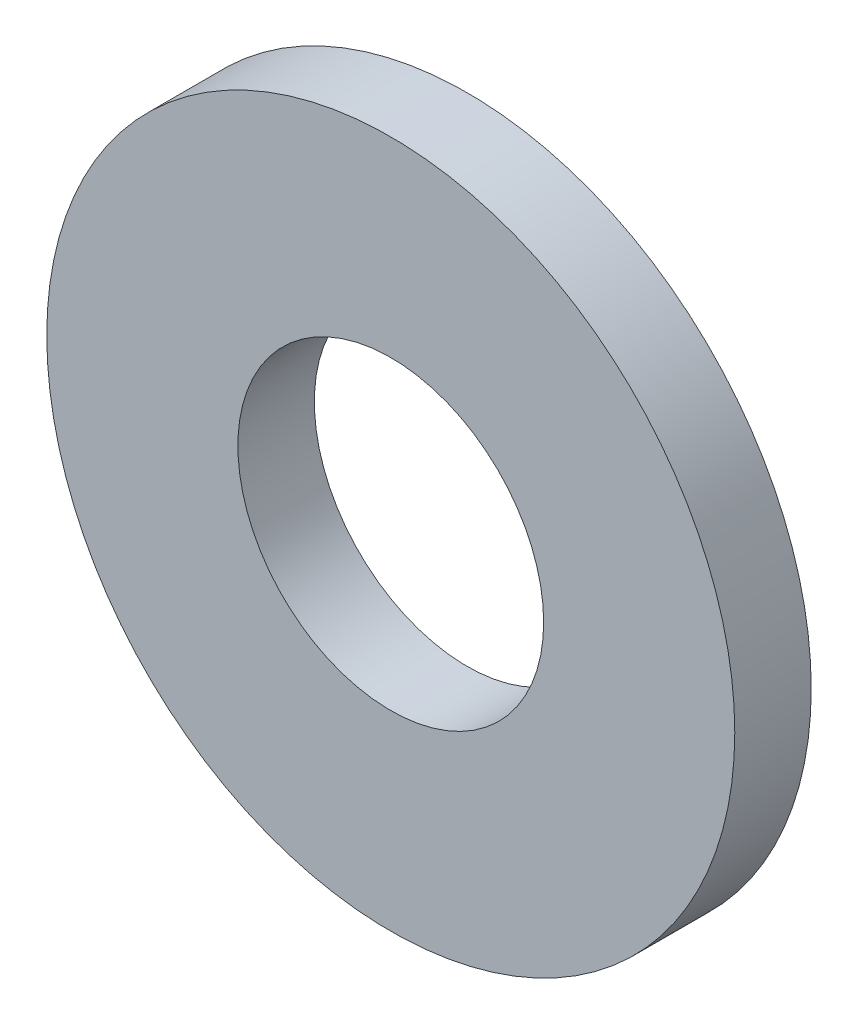
ISO-10303-21;
HEADER;
FILE_DESCRIPTION(('STEP AP214'),'2;1');
FILE_NAME('part.step','',(''),(''),'','','');
FILE_SCHEMA(('AUTOMOTIVE_DESIGN { 1 0 10303 214 1 1 1 1 }'));
ENDSEC;
DATA;
#1=APPLICATION_CONTEXT('core data for automotive mechanical design processes');
#2=APPLICATION_PROTOCOL_DEFINITION('international standard','automotive_design',2000,#1);
#3=PRODUCT_CONTEXT('',#1,'mechanical');
#4=PRODUCT('Part','Part','',(#3));
#5=PRODUCT_RELATED_PRODUCT_CATEGORY('part','',(#4));
#6=PRODUCT_DEFINITION_FORMATION('','',#4);
#7=PRODUCT_DEFINITION_CONTEXT('part definition',#1,'design');
#8=PRODUCT_DEFINITION('design','',#6,#7);
#9=PRODUCT_DEFINITION_SHAPE('','',#8);
#10=(LENGTH_UNIT() NAMED_UNIT(*) SI_UNIT(.MILLI.,.METRE.));
#11=(NAMED_UNIT(*) PLANE_ANGLE_UNIT() SI_UNIT($,.RADIAN.));
#12=(NAMED_UNIT(*) SI_UNIT($,.STERADIAN.) SOLID_ANGLE_UNIT());
#13=UNCERTAINTY_MEASURE_WITH_UNIT(LENGTH_MEASURE(1.E-05),#10,'distance_accuracy_value','');
#14=(GEOMETRIC_REPRESENTATION_CONTEXT(3) GLOBAL_UNCERTAINTY_ASSIGNED_CONTEXT((#13)) GLOBAL_UNIT_ASSIGNED_CONTEXT((#10,
#11,#12)) REPRESENTATION_CONTEXT('',''));
#15=CARTESIAN_POINT('',(0.,0.,0.));
#16=DIRECTION('',(0.,0.,1.));
#17=DIRECTION('',(1.,0.,0.));
#18=AXIS2_PLACEMENT_3D('',#15,#16,#17);
#19=CARTESIAN_POINT('',(0.,0.,1.));
#20=DIRECTION('',(0.,0.,1.));
#21=DIRECTION('',(1.,0.,0.));
#22=AXIS2_PLACEMENT_3D('',#19,#20,#21);
#23=PLANE('',#22);
#24=CARTESIAN_POINT('',(0.,0.,1.));
#25=DIRECTION('',(0.,0.,1.));
#26=DIRECTION('',(1.,0.,0.));
#27=AXIS2_PLACEMENT_3D('',#24,#25,#26);
#28=CIRCLE('',#27,4.5);
#29=CARTESIAN_POINT('',(4.5,0.,1.));
#30=VERTEX_POINT('',#29);
#31=EDGE_CURVE('E10',#30,#30,#28,.T.);
#32=ORIENTED_EDGE('',*,*,#31,.T.);
#33=EDGE_LOOP('',(#32));
#34=FACE_BOUND('',#33,.T.);
#35=CARTESIAN_POINT('',(0.,0.,1.));
#36=DIRECTION('',(0.,0.,1.));
#37=DIRECTION('',(1.,0.,0.));
#38=AXIS2_PLACEMENT_3D('',#35,#36,#37);
#39=CIRCLE('',#38,2.);
#40=CARTESIAN_POINT('',(2.,0.,1.));
#41=VERTEX_POINT('',#40);
#42=EDGE_CURVE('E43',#41,#41,#39,.T.);
#43=ORIENTED_EDGE('',*,*,#42,.F.);
#44=EDGE_LOOP('',(#43));
#45=FACE_BOUND('',#44,.T.);
#46=ADVANCED_FACE('F32',(#34,#45),#23,.T.);
#47=CARTESIAN_POINT('',(0.,0.,0.));
#48=DIRECTION('',(0.,0.,1.));
#49=DIRECTION('',(1.,0.,0.));
#50=AXIS2_PLACEMENT_3D('',#47,#48,#49);
#51=PLANE('',#50);
#52=CARTESIAN_POINT('',(0.,0.,0.));
#53=DIRECTION('',(0.,0.,1.));
#54=DIRECTION('',(1.,0.,0.));
#55=AXIS2_PLACEMENT_3D('',#52,#53,#54);
#56=CIRCLE('',#55,4.5);
#57=CARTESIAN_POINT('',(4.5,0.,0.));
#58=VERTEX_POINT('',#57);
#59=EDGE_CURVE('E36',#58,#58,#56,.T.);
#60=ORIENTED_EDGE('',*,*,#59,.F.);
#61=EDGE_LOOP('',(#60));
#62=FACE_BOUND('',#61,.T.);
#63=CARTESIAN_POINT('',(0.,0.,0.));
#64=DIRECTION('',(0.,0.,1.));
#65=DIRECTION('',(1.,0.,0.));
#66=AXIS2_PLACEMENT_3D('',#63,#64,#65);
#67=CIRCLE('',#66,2.);
#68=CARTESIAN_POINT('',(2.,0.,0.));
#69=VERTEX_POINT('',#68);
#70=EDGE_CURVE('E45',#69,#69,#67,.T.);
#71=ORIENTED_EDGE('',*,*,#70,.T.);
#72=EDGE_LOOP('',(#71));
#73=FACE_BOUND('',#72,.T.);
#74=ADVANCED_FACE('F55',(#62,#73),#51,.F.);
#75=CARTESIAN_POINT('',(0.,0.,1.));
#76=DIRECTION('',(0.,0.,-1.));
#77=DIRECTION('',(-1.,0.,0.));
#78=AXIS2_PLACEMENT_3D('',#75,#76,#77);
#79=CYLINDRICAL_SURFACE('',#78,4.5);
#80=ORIENTED_EDGE('',*,*,#31,.F.);
#81=EDGE_LOOP('',(#80));
#82=FACE_BOUND('',#81,.T.);
#83=ORIENTED_EDGE('',*,*,#59,.T.);
#84=EDGE_LOOP('',(#83));
#85=FACE_BOUND('',#84,.T.);
#86=ADVANCED_FACE('F34',(#82,#85),#79,.T.);
#87=CARTESIAN_POINT('',(0.,0.,1.));
#88=DIRECTION('',(0.,0.,-1.));
#89=DIRECTION('',(-1.,0.,0.));
#90=AXIS2_PLACEMENT_3D('',#87,#88,#89);
#91=CYLINDRICAL_SURFACE('',#90,2.);
#92=ORIENTED_EDGE('',*,*,#42,.T.);
#93=EDGE_LOOP('',(#92));
#94=FACE_BOUND('',#93,.T.);
#95=ORIENTED_EDGE('',*,*,#70,.F.);
#96=EDGE_LOOP('',(#95));
#97=FACE_BOUND('',#96,.T.);
#98=ADVANCED_FACE('F51',(#94,#97),#91,.F.);
#99=CLOSED_SHELL('',(#46,#74,#86,#98));
#100=MANIFOLD_SOLID_BREP('B2',#99);
#101=ADVANCED_BREP_SHAPE_REPRESENTATION('',(#18,#100),#14);
#102=SHAPE_DEFINITION_REPRESENTATION(#9,#101);
ENDSEC;
END-ISO-10303-21;
